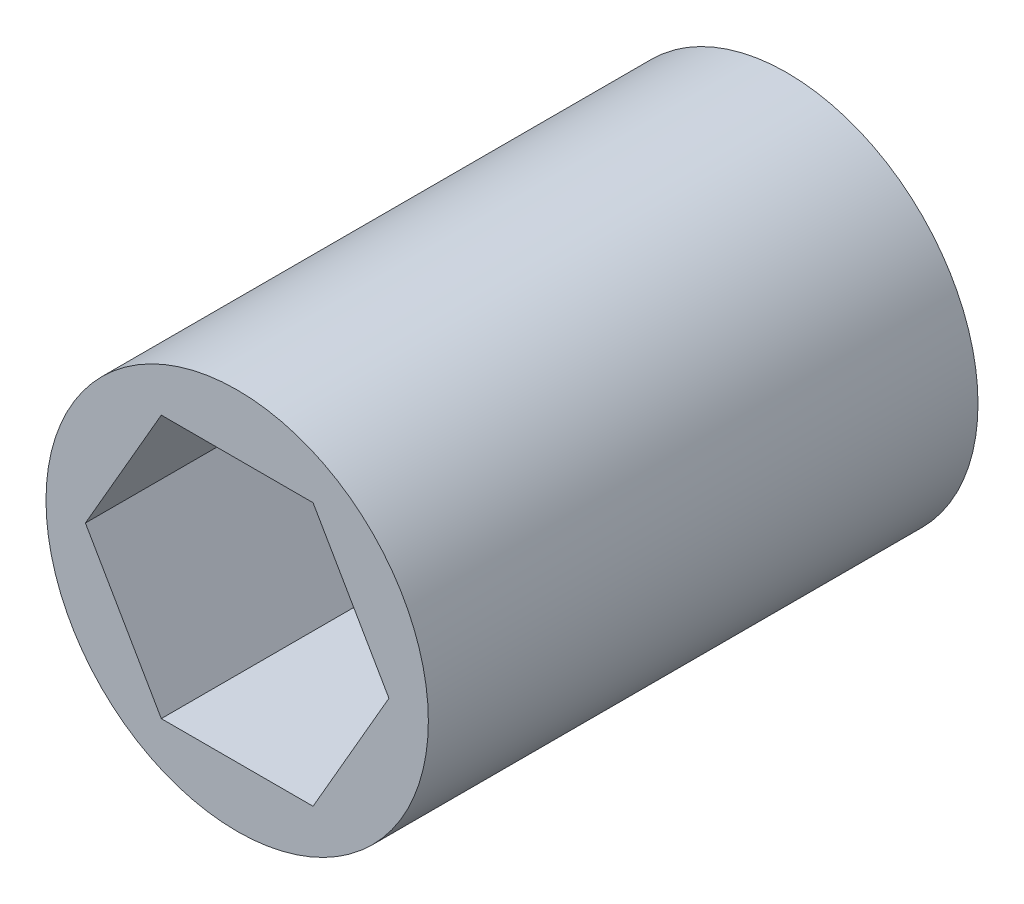
ISO-10303-21;
HEADER;
FILE_DESCRIPTION(('STEP AP214'),'2;1');
FILE_NAME('part.step','',(''),(''),'','','');
FILE_SCHEMA(('AUTOMOTIVE_DESIGN { 1 0 10303 214 1 1 1 1 }'));
ENDSEC;
DATA;
#1=APPLICATION_CONTEXT('core data for automotive mechanical design processes');
#2=APPLICATION_PROTOCOL_DEFINITION('international standard','automotive_design',2000,#1);
#3=PRODUCT_CONTEXT('',#1,'mechanical');
#4=PRODUCT('Part','Part','',(#3));
#5=PRODUCT_RELATED_PRODUCT_CATEGORY('part','',(#4));
#6=PRODUCT_DEFINITION_FORMATION('','',#4);
#7=PRODUCT_DEFINITION_CONTEXT('part definition',#1,'design');
#8=PRODUCT_DEFINITION('design','',#6,#7);
#9=PRODUCT_DEFINITION_SHAPE('','',#8);
#10=(LENGTH_UNIT() NAMED_UNIT(*) SI_UNIT(.MILLI.,.METRE.));
#11=(NAMED_UNIT(*) PLANE_ANGLE_UNIT() SI_UNIT($,.RADIAN.));
#12=(NAMED_UNIT(*) SI_UNIT($,.STERADIAN.) SOLID_ANGLE_UNIT());
#13=UNCERTAINTY_MEASURE_WITH_UNIT(LENGTH_MEASURE(1.E-05),#10,'distance_accuracy_value','');
#14=(GEOMETRIC_REPRESENTATION_CONTEXT(3) GLOBAL_UNCERTAINTY_ASSIGNED_CONTEXT((#13)) GLOBAL_UNIT_ASSIGNED_CONTEXT((#10,
#11,#12)) REPRESENTATION_CONTEXT('',''));
#15=CARTESIAN_POINT('',(0.,0.,0.));
#16=DIRECTION('',(0.,0.,1.));
#17=DIRECTION('',(1.,0.,0.));
#18=AXIS2_PLACEMENT_3D('',#15,#16,#17);
#19=CARTESIAN_POINT('',(0.,0.,0.));
#20=DIRECTION('',(0.,0.,1.));
#21=DIRECTION('',(1.,0.,0.));
#22=AXIS2_PLACEMENT_3D('',#19,#20,#21);
#23=PLANE('',#22);
#24=CARTESIAN_POINT('',(0.,0.,0.));
#25=DIRECTION('',(0.,0.,-1.));
#26=DIRECTION('',(-1.,0.,0.));
#27=AXIS2_PLACEMENT_3D('',#24,#25,#26);
#28=CIRCLE('',#27,1.5);
#29=CARTESIAN_POINT('',(1.5,0.,0.));
#30=VERTEX_POINT('',#29);
#31=EDGE_CURVE('E166',#30,#30,#28,.T.);
#32=ORIENTED_EDGE('',*,*,#31,.F.);
#33=EDGE_LOOP('',(#32));
#34=FACE_BOUND('',#33,.T.);
#35=CARTESIAN_POINT('',(0.,0.,0.));
#36=DIRECTION('',(0.,0.,1.));
#37=DIRECTION('',(1.,0.,0.));
#38=AXIS2_PLACEMENT_3D('',#35,#36,#37);
#39=CIRCLE('',#38,4.);
#40=CARTESIAN_POINT('',(4.,0.,0.));
#41=VERTEX_POINT('',#40);
#42=CARTESIAN_POINT('',(-4.,0.,0.));
#43=VERTEX_POINT('',#42);
#44=EDGE_CURVE('E10',#41,#43,#39,.T.);
#45=ORIENTED_EDGE('',*,*,#44,.F.);
#46=CARTESIAN_POINT('',(0.,0.,0.));
#47=DIRECTION('',(0.,0.,1.));
#48=DIRECTION('',(1.,0.,0.));
#49=AXIS2_PLACEMENT_3D('',#46,#47,#48);
#50=CIRCLE('',#49,4.);
#51=EDGE_CURVE('E26',#43,#41,#50,.T.);
#52=ORIENTED_EDGE('',*,*,#51,.F.);
#53=EDGE_LOOP('',(#45,#52));
#54=FACE_BOUND('',#53,.T.);
#55=ADVANCED_FACE('F15',(#34,#54),#23,.F.);
#56=CARTESIAN_POINT('',(0.,0.,11.5));
#57=DIRECTION('',(0.,0.,1.));
#58=DIRECTION('',(1.,0.,0.));
#59=AXIS2_PLACEMENT_3D('',#56,#57,#58);
#60=PLANE('',#59);
#61=DIRECTION('',(0.5,0.866025403784439,0.));
#62=VECTOR('',#61,1.);
#63=CARTESIAN_POINT('',(-2.77849817047508,0.6875,11.5));
#64=LINE('',#63,#62);
#65=CARTESIAN_POINT('',(-3.17542648054294,0.,11.5));
#66=VERTEX_POINT('',#65);
#67=CARTESIAN_POINT('',(-1.58771324027147,2.75,11.5));
#68=VERTEX_POINT('',#67);
#69=EDGE_CURVE('E147',#66,#68,#64,.T.);
#70=ORIENTED_EDGE('',*,*,#69,.T.);
#71=DIRECTION('',(1.,0.,0.));
#72=VECTOR('',#71,1.);
#73=CARTESIAN_POINT('',(-0.793856620135739,2.75,11.5));
#74=LINE('',#73,#72);
#75=CARTESIAN_POINT('',(1.58771324027147,2.75,11.5));
#76=VERTEX_POINT('',#75);
#77=EDGE_CURVE('E117',#68,#76,#74,.T.);
#78=ORIENTED_EDGE('',*,*,#77,.T.);
#79=DIRECTION('',(0.5,-0.866025403784439,0.));
#80=VECTOR('',#79,1.);
#81=CARTESIAN_POINT('',(1.98464155033934,2.0625,11.5));
#82=LINE('',#81,#80);
#83=CARTESIAN_POINT('',(3.17542648054294,0.,11.5));
#84=VERTEX_POINT('',#83);
#85=EDGE_CURVE('E130',#76,#84,#82,.T.);
#86=ORIENTED_EDGE('',*,*,#85,.T.);
#87=DIRECTION('',(-0.5,-0.866025403784439,0.));
#88=VECTOR('',#87,1.);
#89=CARTESIAN_POINT('',(2.77849817047507,-0.6875,11.5));
#90=LINE('',#89,#88);
#91=CARTESIAN_POINT('',(1.58771324027147,-2.75,11.5));
#92=VERTEX_POINT('',#91);
#93=EDGE_CURVE('E174',#84,#92,#90,.T.);
#94=ORIENTED_EDGE('',*,*,#93,.T.);
#95=DIRECTION('',(-1.,0.,0.));
#96=VECTOR('',#95,1.);
#97=CARTESIAN_POINT('',(0.793856620135737,-2.75,11.5));
#98=LINE('',#97,#96);
#99=CARTESIAN_POINT('',(-1.58771324027147,-2.75,11.5));
#100=VERTEX_POINT('',#99);
#101=EDGE_CURVE('E182',#92,#100,#98,.T.);
#102=ORIENTED_EDGE('',*,*,#101,.T.);
#103=DIRECTION('',(-0.5,0.866025403784439,0.));
#104=VECTOR('',#103,1.);
#105=CARTESIAN_POINT('',(-1.98464155033934,-2.0625,11.5));
#106=LINE('',#105,#104);
#107=EDGE_CURVE('E173',#100,#66,#106,.T.);
#108=ORIENTED_EDGE('',*,*,#107,.T.);
#109=EDGE_LOOP('',(#70,#78,#86,#94,#102,#108));
#110=FACE_BOUND('',#109,.T.);
#111=CARTESIAN_POINT('',(0.,0.,11.5));
#112=DIRECTION('',(0.,0.,1.));
#113=DIRECTION('',(1.,0.,0.));
#114=AXIS2_PLACEMENT_3D('',#111,#112,#113);
#115=CIRCLE('',#114,4.);
#116=CARTESIAN_POINT('',(4.,0.,11.5));
#117=VERTEX_POINT('',#116);
#118=CARTESIAN_POINT('',(-4.,0.,11.5));
#119=VERTEX_POINT('',#118);
#120=EDGE_CURVE('E169',#117,#119,#115,.T.);
#121=ORIENTED_EDGE('',*,*,#120,.T.);
#122=CARTESIAN_POINT('',(0.,0.,11.5));
#123=DIRECTION('',(0.,0.,1.));
#124=DIRECTION('',(1.,0.,0.));
#125=AXIS2_PLACEMENT_3D('',#122,#123,#124);
#126=CIRCLE('',#125,4.);
#127=EDGE_CURVE('E19',#119,#117,#126,.T.);
#128=ORIENTED_EDGE('',*,*,#127,.T.);
#129=EDGE_LOOP('',(#121,#128));
#130=FACE_BOUND('',#129,.T.);
#131=ADVANCED_FACE('F212',(#110,#130),#60,.T.);
#132=CARTESIAN_POINT('',(0.,0.,0.));
#133=DIRECTION('',(0.,0.,1.));
#134=DIRECTION('',(1.,0.,0.));
#135=AXIS2_PLACEMENT_3D('',#132,#133,#134);
#136=CYLINDRICAL_SURFACE('',#135,4.);
#137=ORIENTED_EDGE('',*,*,#120,.F.);
#138=ORIENTED_EDGE('',*,*,#127,.F.);
#139=DIRECTION('',(0.,0.,-1.));
#140=VECTOR('',#139,1.);
#141=CARTESIAN_POINT('',(-4.,0.,0.));
#142=LINE('',#141,#140);
#143=EDGE_CURVE('E144',#119,#43,#142,.T.);
#144=ORIENTED_EDGE('',*,*,#143,.T.);
#145=ORIENTED_EDGE('',*,*,#51,.T.);
#146=ORIENTED_EDGE('',*,*,#44,.T.);
#147=ORIENTED_EDGE('',*,*,#143,.F.);
#148=EDGE_LOOP('',(#137,#138,#144,#145,#146,#147));
#149=FACE_BOUND('',#148,.T.);
#150=ADVANCED_FACE('F282',(#149),#136,.T.);
#151=CARTESIAN_POINT('',(0.,0.,0.));
#152=DIRECTION('',(0.,0.,1.));
#153=DIRECTION('',(-1.,0.,0.));
#154=AXIS2_PLACEMENT_3D('',#151,#152,#153);
#155=CYLINDRICAL_SURFACE('',#154,1.5);
#156=CARTESIAN_POINT('',(0.,0.,7.));
#157=DIRECTION('',(0.,0.,1.));
#158=DIRECTION('',(-1.,0.,0.));
#159=AXIS2_PLACEMENT_3D('',#156,#157,#158);
#160=CIRCLE('',#159,1.5);
#161=CARTESIAN_POINT('',(1.5,0.,7.));
#162=VERTEX_POINT('',#161);
#163=EDGE_CURVE('E116',#162,#162,#160,.T.);
#164=ORIENTED_EDGE('',*,*,#163,.T.);
#165=DIRECTION('',(0.,0.,-1.));
#166=VECTOR('',#165,1.);
#167=CARTESIAN_POINT('',(1.5,0.,0.));
#168=LINE('',#167,#166);
#169=EDGE_CURVE('E170',#162,#30,#168,.T.);
#170=ORIENTED_EDGE('',*,*,#169,.T.);
#171=ORIENTED_EDGE('',*,*,#31,.T.);
#172=ORIENTED_EDGE('',*,*,#169,.F.);
#173=EDGE_LOOP('',(#164,#170,#171,#172));
#174=FACE_BOUND('',#173,.T.);
#175=ADVANCED_FACE('F17',(#174),#155,.F.);
#176=CARTESIAN_POINT('',(0.,0.,7.));
#177=DIRECTION('',(0.,0.,-1.));
#178=DIRECTION('',(0.,-1.,0.));
#179=AXIS2_PLACEMENT_3D('',#176,#177,#178);
#180=PLANE('',#179);
#181=ORIENTED_EDGE('',*,*,#163,.F.);
#182=EDGE_LOOP('',(#181));
#183=FACE_BOUND('',#182,.T.);
#184=DIRECTION('',(1.,0.,0.));
#185=VECTOR('',#184,1.);
#186=CARTESIAN_POINT('',(1.58771324027147,2.75,7.));
#187=LINE('',#186,#185);
#188=CARTESIAN_POINT('',(-1.58771324027147,2.75,7.));
#189=VERTEX_POINT('',#188);
#190=CARTESIAN_POINT('',(1.58771324027147,2.75,7.));
#191=VERTEX_POINT('',#190);
#192=EDGE_CURVE('E104',#189,#191,#187,.T.);
#193=ORIENTED_EDGE('',*,*,#192,.F.);
#194=DIRECTION('',(0.5,0.866025403784439,0.));
#195=VECTOR('',#194,1.);
#196=CARTESIAN_POINT('',(-1.58771324027147,2.75,7.));
#197=LINE('',#196,#195);
#198=CARTESIAN_POINT('',(-3.17542648054294,0.,7.));
#199=VERTEX_POINT('',#198);
#200=EDGE_CURVE('E140',#199,#189,#197,.T.);
#201=ORIENTED_EDGE('',*,*,#200,.F.);
#202=DIRECTION('',(-0.5,0.866025403784439,0.));
#203=VECTOR('',#202,1.);
#204=CARTESIAN_POINT('',(-3.17542648054294,0.,7.));
#205=LINE('',#204,#203);
#206=CARTESIAN_POINT('',(-1.58771324027147,-2.75,7.));
#207=VERTEX_POINT('',#206);
#208=EDGE_CURVE('E185',#207,#199,#205,.T.);
#209=ORIENTED_EDGE('',*,*,#208,.F.);
#210=DIRECTION('',(-1.,0.,0.));
#211=VECTOR('',#210,1.);
#212=CARTESIAN_POINT('',(-1.58771324027147,-2.75,7.));
#213=LINE('',#212,#211);
#214=CARTESIAN_POINT('',(1.58771324027147,-2.75,7.));
#215=VERTEX_POINT('',#214);
#216=EDGE_CURVE('E177',#215,#207,#213,.T.);
#217=ORIENTED_EDGE('',*,*,#216,.F.);
#218=DIRECTION('',(-0.5,-0.866025403784439,0.));
#219=VECTOR('',#218,1.);
#220=CARTESIAN_POINT('',(1.58771324027147,-2.75,7.));
#221=LINE('',#220,#219);
#222=CARTESIAN_POINT('',(3.17542648054294,0.,7.));
#223=VERTEX_POINT('',#222);
#224=EDGE_CURVE('E123',#223,#215,#221,.T.);
#225=ORIENTED_EDGE('',*,*,#224,.F.);
#226=DIRECTION('',(0.5,-0.866025403784439,0.));
#227=VECTOR('',#226,1.);
#228=CARTESIAN_POINT('',(3.17542648054294,0.,7.));
#229=LINE('',#228,#227);
#230=EDGE_CURVE('E120',#191,#223,#229,.T.);
#231=ORIENTED_EDGE('',*,*,#230,.F.);
#232=EDGE_LOOP('',(#193,#201,#209,#217,#225,#231));
#233=FACE_BOUND('',#232,.T.);
#234=ADVANCED_FACE('F121',(#183,#233),#180,.F.);
#235=CARTESIAN_POINT('',(-1.58771324027147,2.75,11.5));
#236=DIRECTION('',(0.,1.,0.));
#237=DIRECTION('',(1.,0.,0.));
#238=AXIS2_PLACEMENT_3D('',#235,#236,#237);
#239=PLANE('',#238);
#240=ORIENTED_EDGE('',*,*,#77,.F.);
#241=DIRECTION('',(0.,0.,-1.));
#242=VECTOR('',#241,1.);
#243=CARTESIAN_POINT('',(-1.58771324027147,2.75,11.5));
#244=LINE('',#243,#242);
#245=EDGE_CURVE('E111',#68,#189,#244,.T.);
#246=ORIENTED_EDGE('',*,*,#245,.T.);
#247=ORIENTED_EDGE('',*,*,#192,.T.);
#248=DIRECTION('',(0.,0.,-1.));
#249=VECTOR('',#248,1.);
#250=CARTESIAN_POINT('',(1.58771324027147,2.75,11.5));
#251=LINE('',#250,#249);
#252=EDGE_CURVE('E108',#76,#191,#251,.T.);
#253=ORIENTED_EDGE('',*,*,#252,.F.);
#254=EDGE_LOOP('',(#240,#246,#247,#253));
#255=FACE_BOUND('',#254,.T.);
#256=ADVANCED_FACE('F106',(#255),#239,.F.);
#257=CARTESIAN_POINT('',(1.58771324027147,2.75,11.5));
#258=DIRECTION('',(0.866025403784439,0.5,0.));
#259=DIRECTION('',(0.,0.,-1.));
#260=AXIS2_PLACEMENT_3D('',#257,#258,#259);
#261=PLANE('',#260);
#262=ORIENTED_EDGE('',*,*,#85,.F.);
#263=ORIENTED_EDGE('',*,*,#252,.T.);
#264=ORIENTED_EDGE('',*,*,#230,.T.);
#265=DIRECTION('',(0.,0.,-1.));
#266=VECTOR('',#265,1.);
#267=CARTESIAN_POINT('',(3.17542648054294,0.,11.5));
#268=LINE('',#267,#266);
#269=EDGE_CURVE('E164',#84,#223,#268,.T.);
#270=ORIENTED_EDGE('',*,*,#269,.F.);
#271=EDGE_LOOP('',(#262,#263,#264,#270));
#272=FACE_BOUND('',#271,.T.);
#273=ADVANCED_FACE('F129',(#272),#261,.F.);
#274=CARTESIAN_POINT('',(3.17542648054294,0.,11.5));
#275=DIRECTION('',(0.866025403784439,-0.5,0.));
#276=DIRECTION('',(0.,0.,-1.));
#277=AXIS2_PLACEMENT_3D('',#274,#275,#276);
#278=PLANE('',#277);
#279=ORIENTED_EDGE('',*,*,#93,.F.);
#280=ORIENTED_EDGE('',*,*,#269,.T.);
#281=ORIENTED_EDGE('',*,*,#224,.T.);
#282=DIRECTION('',(0.,0.,-1.));
#283=VECTOR('',#282,1.);
#284=CARTESIAN_POINT('',(1.58771324027147,-2.75,11.5));
#285=LINE('',#284,#283);
#286=EDGE_CURVE('E178',#92,#215,#285,.T.);
#287=ORIENTED_EDGE('',*,*,#286,.F.);
#288=EDGE_LOOP('',(#279,#280,#281,#287));
#289=FACE_BOUND('',#288,.T.);
#290=ADVANCED_FACE('F266',(#289),#278,.F.);
#291=CARTESIAN_POINT('',(1.58771324027147,-2.75,11.5));
#292=DIRECTION('',(0.,-1.,0.));
#293=DIRECTION('',(0.,0.,-1.));
#294=AXIS2_PLACEMENT_3D('',#291,#292,#293);
#295=PLANE('',#294);
#296=ORIENTED_EDGE('',*,*,#101,.F.);
#297=ORIENTED_EDGE('',*,*,#286,.T.);
#298=ORIENTED_EDGE('',*,*,#216,.T.);
#299=DIRECTION('',(0.,0.,-1.));
#300=VECTOR('',#299,1.);
#301=CARTESIAN_POINT('',(-1.58771324027147,-2.75,11.5));
#302=LINE('',#301,#300);
#303=EDGE_CURVE('E189',#100,#207,#302,.T.);
#304=ORIENTED_EDGE('',*,*,#303,.F.);
#305=EDGE_LOOP('',(#296,#297,#298,#304));
#306=FACE_BOUND('',#305,.T.);
#307=ADVANCED_FACE('F262',(#306),#295,.F.);
#308=CARTESIAN_POINT('',(-1.58771324027147,-2.75,11.5));
#309=DIRECTION('',(-0.866025403784439,-0.5,0.));
#310=DIRECTION('',(-0.5,0.866025403784439,0.));
#311=AXIS2_PLACEMENT_3D('',#308,#309,#310);
#312=PLANE('',#311);
#313=ORIENTED_EDGE('',*,*,#107,.F.);
#314=ORIENTED_EDGE('',*,*,#303,.T.);
#315=ORIENTED_EDGE('',*,*,#208,.T.);
#316=DIRECTION('',(0.,0.,-1.));
#317=VECTOR('',#316,1.);
#318=CARTESIAN_POINT('',(-3.17542648054294,0.,11.5));
#319=LINE('',#318,#317);
#320=EDGE_CURVE('E150',#66,#199,#319,.T.);
#321=ORIENTED_EDGE('',*,*,#320,.F.);
#322=EDGE_LOOP('',(#313,#314,#315,#321));
#323=FACE_BOUND('',#322,.T.);
#324=ADVANCED_FACE('F217',(#323),#312,.F.);
#325=CARTESIAN_POINT('',(-3.17542648054294,0.,11.5));
#326=DIRECTION('',(-0.866025403784439,0.5,0.));
#327=DIRECTION('',(0.,0.,1.));
#328=AXIS2_PLACEMENT_3D('',#325,#326,#327);
#329=PLANE('',#328);
#330=ORIENTED_EDGE('',*,*,#69,.F.);
#331=ORIENTED_EDGE('',*,*,#320,.T.);
#332=ORIENTED_EDGE('',*,*,#200,.T.);
#333=ORIENTED_EDGE('',*,*,#245,.F.);
#334=EDGE_LOOP('',(#330,#331,#332,#333));
#335=FACE_BOUND('',#334,.T.);
#336=ADVANCED_FACE('F219',(#335),#329,.F.);
#337=CLOSED_SHELL('',(#55,#131,#150,#175,#234,#256,#273,#290,#307,#324,#336));
#338=MANIFOLD_SOLID_BREP('B1',#337);
#339=ADVANCED_BREP_SHAPE_REPRESENTATION('',(#18,#338),#14);
#340=SHAPE_DEFINITION_REPRESENTATION(#9,#339);
ENDSEC;
END-ISO-10303-21;
